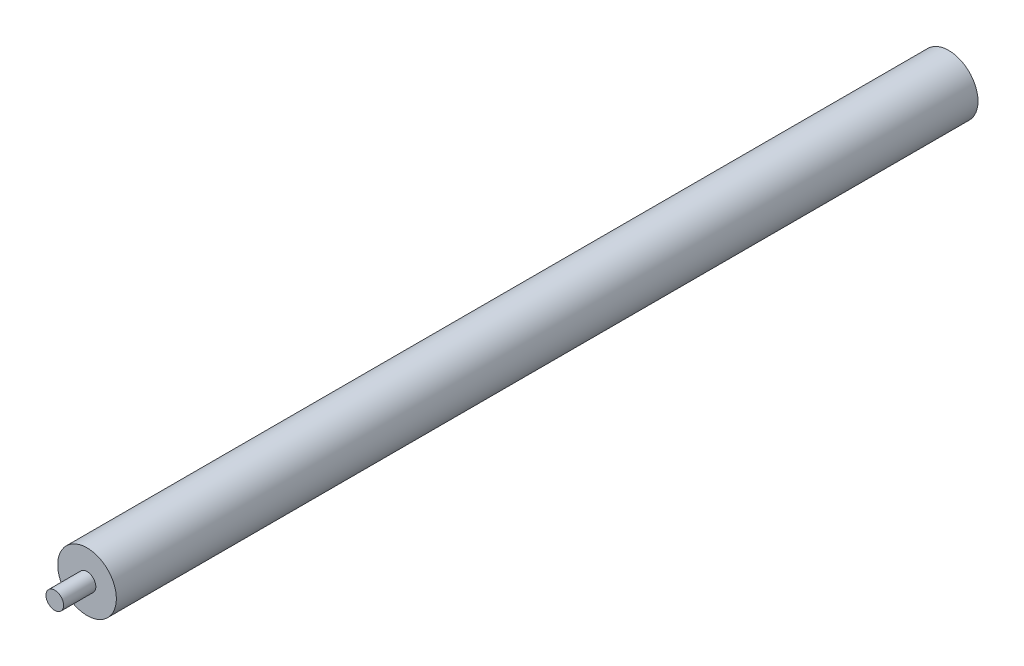
ISO-10303-21;
HEADER;
FILE_DESCRIPTION(('STEP AP214'),'2;1');
FILE_NAME('part.step','',(''),(''),'','','');
FILE_SCHEMA(('AUTOMOTIVE_DESIGN { 1 0 10303 214 1 1 1 1 }'));
ENDSEC;
DATA;
#1=APPLICATION_CONTEXT('core data for automotive mechanical design processes');
#2=APPLICATION_PROTOCOL_DEFINITION('international standard','automotive_design',2000,#1);
#3=PRODUCT_CONTEXT('',#1,'mechanical');
#4=PRODUCT('Part','Part','',(#3));
#5=PRODUCT_RELATED_PRODUCT_CATEGORY('part','',(#4));
#6=PRODUCT_DEFINITION_FORMATION('','',#4);
#7=PRODUCT_DEFINITION_CONTEXT('part definition',#1,'design');
#8=PRODUCT_DEFINITION('design','',#6,#7);
#9=PRODUCT_DEFINITION_SHAPE('','',#8);
#10=(LENGTH_UNIT() NAMED_UNIT(*) SI_UNIT(.MILLI.,.METRE.));
#11=(NAMED_UNIT(*) PLANE_ANGLE_UNIT() SI_UNIT($,.RADIAN.));
#12=(NAMED_UNIT(*) SI_UNIT($,.STERADIAN.) SOLID_ANGLE_UNIT());
#13=UNCERTAINTY_MEASURE_WITH_UNIT(LENGTH_MEASURE(1.E-05),#10,'distance_accuracy_value','');
#14=(GEOMETRIC_REPRESENTATION_CONTEXT(3) GLOBAL_UNCERTAINTY_ASSIGNED_CONTEXT((#13)) GLOBAL_UNIT_ASSIGNED_CONTEXT((#10,
#11,#12)) REPRESENTATION_CONTEXT('',''));
#15=CARTESIAN_POINT('',(0.,0.,0.));
#16=DIRECTION('',(0.,0.,1.));
#17=DIRECTION('',(1.,0.,0.));
#18=AXIS2_PLACEMENT_3D('',#15,#16,#17);
#19=CARTESIAN_POINT('',(0.,0.,0.));
#20=DIRECTION('',(0.,0.,1.));
#21=DIRECTION('',(1.,0.,0.));
#22=AXIS2_PLACEMENT_3D('',#19,#20,#21);
#23=CYLINDRICAL_SURFACE('',#22,10.);
#24=CARTESIAN_POINT('',(0.,0.,-304.8));
#25=DIRECTION('',(0.,0.,1.));
#26=DIRECTION('',(1.,0.,0.));
#27=AXIS2_PLACEMENT_3D('',#24,#25,#26);
#28=CIRCLE('',#27,10.);
#29=CARTESIAN_POINT('',(10.,0.,-304.8));
#30=VERTEX_POINT('',#29);
#31=EDGE_CURVE('E10',#30,#30,#28,.T.);
#32=ORIENTED_EDGE('',*,*,#31,.T.);
#33=EDGE_LOOP('',(#32));
#34=FACE_BOUND('',#33,.T.);
#35=CARTESIAN_POINT('',(0.,0.,-11.));
#36=DIRECTION('',(0.,0.,1.));
#37=DIRECTION('',(1.,0.,0.));
#38=AXIS2_PLACEMENT_3D('',#35,#36,#37);
#39=CIRCLE('',#38,10.);
#40=CARTESIAN_POINT('',(10.,0.,-11.));
#41=VERTEX_POINT('',#40);
#42=EDGE_CURVE('E44',#41,#41,#39,.T.);
#43=ORIENTED_EDGE('',*,*,#42,.F.);
#44=EDGE_LOOP('',(#43));
#45=FACE_BOUND('',#44,.T.);
#46=ADVANCED_FACE('F30',(#34,#45),#23,.T.);
#47=CARTESIAN_POINT('',(10.,0.,-304.8));
#48=DIRECTION('',(0.,0.,-1.));
#49=DIRECTION('',(-1.,0.,0.));
#50=AXIS2_PLACEMENT_3D('',#47,#48,#49);
#51=PLANE('',#50);
#52=ORIENTED_EDGE('',*,*,#31,.F.);
#53=EDGE_LOOP('',(#52));
#54=FACE_BOUND('',#53,.T.);
#55=ADVANCED_FACE('F54',(#54),#51,.T.);
#56=CARTESIAN_POINT('',(0.,0.,0.));
#57=DIRECTION('',(0.,0.,1.));
#58=DIRECTION('',(1.,0.,0.));
#59=AXIS2_PLACEMENT_3D('',#56,#57,#58);
#60=PLANE('',#59);
#61=CARTESIAN_POINT('',(0.,0.,0.));
#62=DIRECTION('',(0.,0.,1.));
#63=DIRECTION('',(1.,0.,0.));
#64=AXIS2_PLACEMENT_3D('',#61,#62,#63);
#65=CIRCLE('',#64,3.);
#66=CARTESIAN_POINT('',(3.,0.,0.));
#67=VERTEX_POINT('',#66);
#68=EDGE_CURVE('E36',#67,#67,#65,.T.);
#69=ORIENTED_EDGE('',*,*,#68,.T.);
#70=EDGE_LOOP('',(#69));
#71=FACE_BOUND('',#70,.T.);
#72=ADVANCED_FACE('F58',(#71),#60,.T.);
#73=CARTESIAN_POINT('',(0.,0.,0.));
#74=DIRECTION('',(0.,0.,1.));
#75=DIRECTION('',(1.,0.,0.));
#76=AXIS2_PLACEMENT_3D('',#73,#74,#75);
#77=CYLINDRICAL_SURFACE('',#76,3.);
#78=CARTESIAN_POINT('',(0.,0.,-11.));
#79=DIRECTION('',(0.,0.,1.));
#80=DIRECTION('',(1.,0.,0.));
#81=AXIS2_PLACEMENT_3D('',#78,#79,#80);
#82=CIRCLE('',#81,3.);
#83=CARTESIAN_POINT('',(3.,0.,-11.));
#84=VERTEX_POINT('',#83);
#85=EDGE_CURVE('E40',#84,#84,#82,.T.);
#86=ORIENTED_EDGE('',*,*,#85,.T.);
#87=EDGE_LOOP('',(#86));
#88=FACE_BOUND('',#87,.T.);
#89=ORIENTED_EDGE('',*,*,#68,.F.);
#90=EDGE_LOOP('',(#89));
#91=FACE_BOUND('',#90,.T.);
#92=ADVANCED_FACE('F63',(#88,#91),#77,.T.);
#93=CARTESIAN_POINT('',(3.,0.,-11.));
#94=DIRECTION('',(0.,0.,1.));
#95=DIRECTION('',(1.,0.,0.));
#96=AXIS2_PLACEMENT_3D('',#93,#94,#95);
#97=PLANE('',#96);
#98=ORIENTED_EDGE('',*,*,#42,.T.);
#99=EDGE_LOOP('',(#98));
#100=FACE_BOUND('',#99,.T.);
#101=ORIENTED_EDGE('',*,*,#85,.F.);
#102=EDGE_LOOP('',(#101));
#103=FACE_BOUND('',#102,.T.);
#104=ADVANCED_FACE('F50',(#100,#103),#97,.T.);
#105=CLOSED_SHELL('',(#46,#55,#72,#92,#104));
#106=MANIFOLD_SOLID_BREP('B2',#105);
#107=ADVANCED_BREP_SHAPE_REPRESENTATION('',(#18,#106),#14);
#108=SHAPE_DEFINITION_REPRESENTATION(#9,#107);
ENDSEC;
END-ISO-10303-21;
